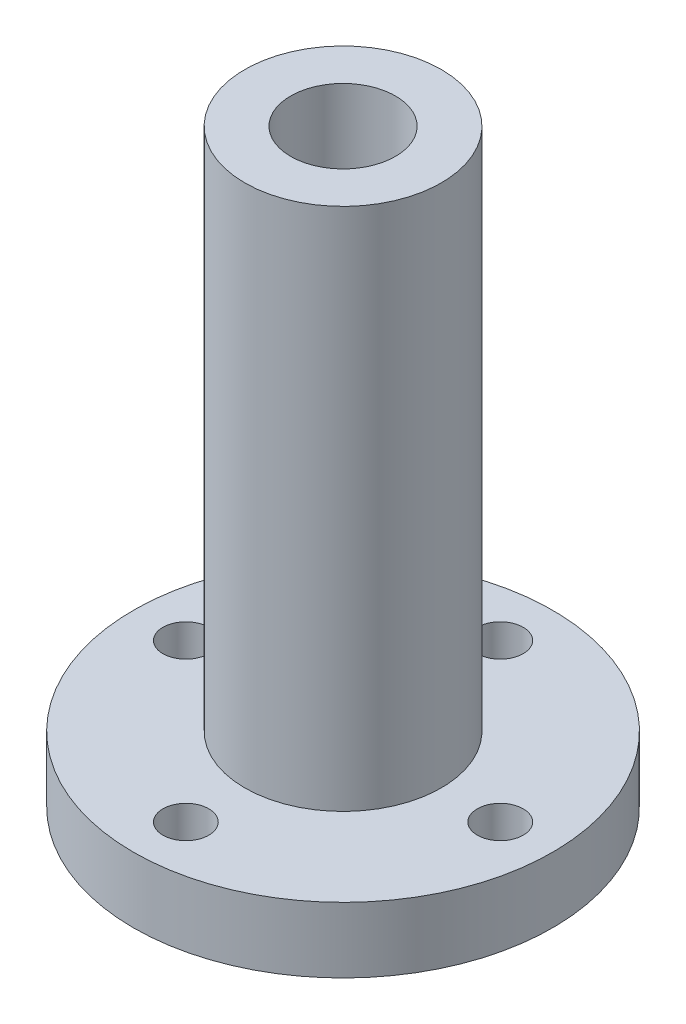
ISO-10303-21;
HEADER;
FILE_DESCRIPTION(('STEP AP214'),'2;1');
FILE_NAME('part.step','',(''),(''),'','','');
FILE_SCHEMA(('AUTOMOTIVE_DESIGN { 1 0 10303 214 1 1 1 1 }'));
ENDSEC;
DATA;
#1=APPLICATION_CONTEXT('core data for automotive mechanical design processes');
#2=APPLICATION_PROTOCOL_DEFINITION('international standard','automotive_design',2000,#1);
#3=PRODUCT_CONTEXT('',#1,'mechanical');
#4=PRODUCT('Part','Part','',(#3));
#5=PRODUCT_RELATED_PRODUCT_CATEGORY('part','',(#4));
#6=PRODUCT_DEFINITION_FORMATION('','',#4);
#7=PRODUCT_DEFINITION_CONTEXT('part definition',#1,'design');
#8=PRODUCT_DEFINITION('design','',#6,#7);
#9=PRODUCT_DEFINITION_SHAPE('','',#8);
#10=(LENGTH_UNIT() NAMED_UNIT(*) SI_UNIT(.MILLI.,.METRE.));
#11=(NAMED_UNIT(*) PLANE_ANGLE_UNIT() SI_UNIT($,.RADIAN.));
#12=(NAMED_UNIT(*) SI_UNIT($,.STERADIAN.) SOLID_ANGLE_UNIT());
#13=UNCERTAINTY_MEASURE_WITH_UNIT(LENGTH_MEASURE(1.E-05),#10,'distance_accuracy_value','');
#14=(GEOMETRIC_REPRESENTATION_CONTEXT(3) GLOBAL_UNCERTAINTY_ASSIGNED_CONTEXT((#13)) GLOBAL_UNIT_ASSIGNED_CONTEXT((#10,
#11,#12)) REPRESENTATION_CONTEXT('',''));
#15=CARTESIAN_POINT('',(0.,0.,0.));
#16=DIRECTION('',(0.,0.,1.));
#17=DIRECTION('',(1.,0.,0.));
#18=AXIS2_PLACEMENT_3D('',#15,#16,#17);
#19=CARTESIAN_POINT('',(0.,5.,0.));
#20=DIRECTION('',(0.,1.,0.));
#21=DIRECTION('',(0.,0.,1.));
#22=AXIS2_PLACEMENT_3D('',#19,#20,#21);
#23=PLANE('',#22);
#24=CARTESIAN_POINT('',(0.,5.,12.));
#25=DIRECTION('',(0.,1.,0.));
#26=DIRECTION('',(0.,0.,1.));
#27=AXIS2_PLACEMENT_3D('',#24,#25,#26);
#28=CIRCLE('',#27,1.75);
#29=CARTESIAN_POINT('',(0.,5.,13.75));
#30=VERTEX_POINT('',#29);
#31=EDGE_CURVE('E64',#30,#30,#28,.T.);
#32=ORIENTED_EDGE('',*,*,#31,.F.);
#33=EDGE_LOOP('',(#32));
#34=FACE_BOUND('',#33,.T.);
#35=CARTESIAN_POINT('',(-12.,5.,0.));
#36=DIRECTION('',(0.,1.,0.));
#37=DIRECTION('',(0.,0.,1.));
#38=AXIS2_PLACEMENT_3D('',#35,#36,#37);
#39=CIRCLE('',#38,1.75);
#40=CARTESIAN_POINT('',(-12.,5.,1.75));
#41=VERTEX_POINT('',#40);
#42=EDGE_CURVE('E52',#41,#41,#39,.T.);
#43=ORIENTED_EDGE('',*,*,#42,.F.);
#44=EDGE_LOOP('',(#43));
#45=FACE_BOUND('',#44,.T.);
#46=CARTESIAN_POINT('',(0.,5.,0.));
#47=DIRECTION('',(0.,1.,0.));
#48=DIRECTION('',(0.,0.,1.));
#49=AXIS2_PLACEMENT_3D('',#46,#47,#48);
#50=CIRCLE('',#49,16.);
#51=CARTESIAN_POINT('',(0.,5.,16.));
#52=VERTEX_POINT('',#51);
#53=EDGE_CURVE('E10',#52,#52,#50,.T.);
#54=ORIENTED_EDGE('',*,*,#53,.T.);
#55=EDGE_LOOP('',(#54));
#56=FACE_BOUND('',#55,.T.);
#57=CARTESIAN_POINT('',(0.,5.,-12.));
#58=DIRECTION('',(0.,1.,0.));
#59=DIRECTION('',(0.,0.,1.));
#60=AXIS2_PLACEMENT_3D('',#57,#58,#59);
#61=CIRCLE('',#60,1.75);
#62=CARTESIAN_POINT('',(0.,5.,-10.25));
#63=VERTEX_POINT('',#62);
#64=EDGE_CURVE('E48',#63,#63,#61,.T.);
#65=ORIENTED_EDGE('',*,*,#64,.F.);
#66=EDGE_LOOP('',(#65));
#67=FACE_BOUND('',#66,.T.);
#68=CARTESIAN_POINT('',(12.,5.,0.));
#69=DIRECTION('',(0.,1.,0.));
#70=DIRECTION('',(0.,0.,1.));
#71=AXIS2_PLACEMENT_3D('',#68,#69,#70);
#72=CIRCLE('',#71,1.75);
#73=CARTESIAN_POINT('',(12.,5.,1.75));
#74=VERTEX_POINT('',#73);
#75=EDGE_CURVE('E58',#74,#74,#72,.T.);
#76=ORIENTED_EDGE('',*,*,#75,.F.);
#77=EDGE_LOOP('',(#76));
#78=FACE_BOUND('',#77,.T.);
#79=CARTESIAN_POINT('',(0.,5.,0.));
#80=DIRECTION('',(0.,1.,0.));
#81=DIRECTION('',(0.,0.,1.));
#82=AXIS2_PLACEMENT_3D('',#79,#80,#81);
#83=CIRCLE('',#82,7.5);
#84=CARTESIAN_POINT('',(0.,5.,7.5));
#85=VERTEX_POINT('',#84);
#86=EDGE_CURVE('E73',#85,#85,#83,.T.);
#87=ORIENTED_EDGE('',*,*,#86,.F.);
#88=EDGE_LOOP('',(#87));
#89=FACE_BOUND('',#88,.T.);
#90=ADVANCED_FACE('F33',(#34,#45,#56,#67,#78,#89),#23,.T.);
#91=CARTESIAN_POINT('',(0.,0.,0.));
#92=DIRECTION('',(0.,1.,0.));
#93=DIRECTION('',(0.,0.,1.));
#94=AXIS2_PLACEMENT_3D('',#91,#92,#93);
#95=PLANE('',#94);
#96=CARTESIAN_POINT('',(0.,0.,0.));
#97=DIRECTION('',(0.,1.,0.));
#98=DIRECTION('',(0.,0.,1.));
#99=AXIS2_PLACEMENT_3D('',#96,#97,#98);
#100=CIRCLE('',#99,16.);
#101=CARTESIAN_POINT('',(0.,0.,16.));
#102=VERTEX_POINT('',#101);
#103=EDGE_CURVE('E37',#102,#102,#100,.T.);
#104=ORIENTED_EDGE('',*,*,#103,.F.);
#105=EDGE_LOOP('',(#104));
#106=FACE_BOUND('',#105,.T.);
#107=CARTESIAN_POINT('',(0.,0.,0.));
#108=DIRECTION('',(0.,1.,0.));
#109=DIRECTION('',(0.,0.,1.));
#110=AXIS2_PLACEMENT_3D('',#107,#108,#109);
#111=CIRCLE('',#110,4.);
#112=CARTESIAN_POINT('',(0.,0.,4.));
#113=VERTEX_POINT('',#112);
#114=EDGE_CURVE('E44',#113,#113,#111,.T.);
#115=ORIENTED_EDGE('',*,*,#114,.T.);
#116=EDGE_LOOP('',(#115));
#117=FACE_BOUND('',#116,.T.);
#118=CARTESIAN_POINT('',(0.,0.,-12.));
#119=DIRECTION('',(0.,1.,0.));
#120=DIRECTION('',(0.,0.,1.));
#121=AXIS2_PLACEMENT_3D('',#118,#119,#120);
#122=CIRCLE('',#121,1.75);
#123=CARTESIAN_POINT('',(0.,0.,-10.25));
#124=VERTEX_POINT('',#123);
#125=EDGE_CURVE('E49',#124,#124,#122,.T.);
#126=ORIENTED_EDGE('',*,*,#125,.T.);
#127=EDGE_LOOP('',(#126));
#128=FACE_BOUND('',#127,.T.);
#129=CARTESIAN_POINT('',(-12.,0.,0.));
#130=DIRECTION('',(0.,1.,0.));
#131=DIRECTION('',(0.,0.,1.));
#132=AXIS2_PLACEMENT_3D('',#129,#130,#131);
#133=CIRCLE('',#132,1.75);
#134=CARTESIAN_POINT('',(-12.,0.,1.75));
#135=VERTEX_POINT('',#134);
#136=EDGE_CURVE('E55',#135,#135,#133,.T.);
#137=ORIENTED_EDGE('',*,*,#136,.T.);
#138=EDGE_LOOP('',(#137));
#139=FACE_BOUND('',#138,.T.);
#140=CARTESIAN_POINT('',(12.,0.,0.));
#141=DIRECTION('',(0.,1.,0.));
#142=DIRECTION('',(0.,0.,1.));
#143=AXIS2_PLACEMENT_3D('',#140,#141,#142);
#144=CIRCLE('',#143,1.75);
#145=CARTESIAN_POINT('',(12.,0.,1.75));
#146=VERTEX_POINT('',#145);
#147=EDGE_CURVE('E61',#146,#146,#144,.T.);
#148=ORIENTED_EDGE('',*,*,#147,.T.);
#149=EDGE_LOOP('',(#148));
#150=FACE_BOUND('',#149,.T.);
#151=CARTESIAN_POINT('',(0.,0.,12.));
#152=DIRECTION('',(0.,1.,0.));
#153=DIRECTION('',(0.,0.,1.));
#154=AXIS2_PLACEMENT_3D('',#151,#152,#153);
#155=CIRCLE('',#154,1.75);
#156=CARTESIAN_POINT('',(0.,0.,13.75));
#157=VERTEX_POINT('',#156);
#158=EDGE_CURVE('E67',#157,#157,#155,.T.);
#159=ORIENTED_EDGE('',*,*,#158,.T.);
#160=EDGE_LOOP('',(#159));
#161=FACE_BOUND('',#160,.T.);
#162=ADVANCED_FACE('F100',(#106,#117,#128,#139,#150,#161),#95,.F.);
#163=CARTESIAN_POINT('',(0.,5.,0.));
#164=DIRECTION('',(0.,-1.,0.));
#165=DIRECTION('',(0.,0.,-1.));
#166=AXIS2_PLACEMENT_3D('',#163,#164,#165);
#167=CYLINDRICAL_SURFACE('',#166,16.);
#168=ORIENTED_EDGE('',*,*,#53,.F.);
#169=EDGE_LOOP('',(#168));
#170=FACE_BOUND('',#169,.T.);
#171=ORIENTED_EDGE('',*,*,#103,.T.);
#172=EDGE_LOOP('',(#171));
#173=FACE_BOUND('',#172,.T.);
#174=ADVANCED_FACE('F35',(#170,#173),#167,.T.);
#175=CARTESIAN_POINT('',(0.,5.,0.));
#176=DIRECTION('',(0.,-1.,0.));
#177=DIRECTION('',(0.,0.,-1.));
#178=AXIS2_PLACEMENT_3D('',#175,#176,#177);
#179=CYLINDRICAL_SURFACE('',#178,4.);
#180=ORIENTED_EDGE('',*,*,#114,.F.);
#181=EDGE_LOOP('',(#180));
#182=FACE_BOUND('',#181,.T.);
#183=CARTESIAN_POINT('',(0.,45.,0.));
#184=DIRECTION('',(0.,1.,0.));
#185=DIRECTION('',(0.,0.,1.));
#186=AXIS2_PLACEMENT_3D('',#183,#184,#185);
#187=CIRCLE('',#186,4.);
#188=CARTESIAN_POINT('',(0.,45.,4.));
#189=VERTEX_POINT('',#188);
#190=EDGE_CURVE('E76',#189,#189,#187,.T.);
#191=ORIENTED_EDGE('',*,*,#190,.T.);
#192=EDGE_LOOP('',(#191));
#193=FACE_BOUND('',#192,.T.);
#194=ADVANCED_FACE('F82',(#182,#193),#179,.F.);
#195=CARTESIAN_POINT('',(0.,5.,-12.));
#196=DIRECTION('',(0.,-1.,0.));
#197=DIRECTION('',(0.,0.,-1.));
#198=AXIS2_PLACEMENT_3D('',#195,#196,#197);
#199=CYLINDRICAL_SURFACE('',#198,1.75);
#200=ORIENTED_EDGE('',*,*,#64,.T.);
#201=EDGE_LOOP('',(#200));
#202=FACE_BOUND('',#201,.T.);
#203=ORIENTED_EDGE('',*,*,#125,.F.);
#204=EDGE_LOOP('',(#203));
#205=FACE_BOUND('',#204,.T.);
#206=ADVANCED_FACE('F112',(#202,#205),#199,.F.);
#207=CARTESIAN_POINT('',(-12.,5.,0.));
#208=DIRECTION('',(0.,-1.,0.));
#209=DIRECTION('',(0.,0.,-1.));
#210=AXIS2_PLACEMENT_3D('',#207,#208,#209);
#211=CYLINDRICAL_SURFACE('',#210,1.75);
#212=ORIENTED_EDGE('',*,*,#42,.T.);
#213=EDGE_LOOP('',(#212));
#214=FACE_BOUND('',#213,.T.);
#215=ORIENTED_EDGE('',*,*,#136,.F.);
#216=EDGE_LOOP('',(#215));
#217=FACE_BOUND('',#216,.T.);
#218=ADVANCED_FACE('F116',(#214,#217),#211,.F.);
#219=CARTESIAN_POINT('',(12.,5.,0.));
#220=DIRECTION('',(0.,-1.,0.));
#221=DIRECTION('',(0.,0.,-1.));
#222=AXIS2_PLACEMENT_3D('',#219,#220,#221);
#223=CYLINDRICAL_SURFACE('',#222,1.75);
#224=ORIENTED_EDGE('',*,*,#75,.T.);
#225=EDGE_LOOP('',(#224));
#226=FACE_BOUND('',#225,.T.);
#227=ORIENTED_EDGE('',*,*,#147,.F.);
#228=EDGE_LOOP('',(#227));
#229=FACE_BOUND('',#228,.T.);
#230=ADVANCED_FACE('F96',(#226,#229),#223,.F.);
#231=CARTESIAN_POINT('',(0.,5.,12.));
#232=DIRECTION('',(0.,-1.,0.));
#233=DIRECTION('',(0.,0.,-1.));
#234=AXIS2_PLACEMENT_3D('',#231,#232,#233);
#235=CYLINDRICAL_SURFACE('',#234,1.75);
#236=ORIENTED_EDGE('',*,*,#31,.T.);
#237=EDGE_LOOP('',(#236));
#238=FACE_BOUND('',#237,.T.);
#239=ORIENTED_EDGE('',*,*,#158,.F.);
#240=EDGE_LOOP('',(#239));
#241=FACE_BOUND('',#240,.T.);
#242=ADVANCED_FACE('F87',(#238,#241),#235,.F.);
#243=CARTESIAN_POINT('',(0.,45.,0.));
#244=DIRECTION('',(0.,1.,0.));
#245=DIRECTION('',(0.,0.,1.));
#246=AXIS2_PLACEMENT_3D('',#243,#244,#245);
#247=PLANE('',#246);
#248=CARTESIAN_POINT('',(0.,45.,0.));
#249=DIRECTION('',(0.,1.,0.));
#250=DIRECTION('',(0.,0.,1.));
#251=AXIS2_PLACEMENT_3D('',#248,#249,#250);
#252=CIRCLE('',#251,7.5);
#253=CARTESIAN_POINT('',(0.,45.,7.5));
#254=VERTEX_POINT('',#253);
#255=EDGE_CURVE('E70',#254,#254,#252,.T.);
#256=ORIENTED_EDGE('',*,*,#255,.T.);
#257=EDGE_LOOP('',(#256));
#258=FACE_BOUND('',#257,.T.);
#259=ORIENTED_EDGE('',*,*,#190,.F.);
#260=EDGE_LOOP('',(#259));
#261=FACE_BOUND('',#260,.T.);
#262=ADVANCED_FACE('F84',(#258,#261),#247,.T.);
#263=CARTESIAN_POINT('',(0.,45.,0.));
#264=DIRECTION('',(0.,-1.,0.));
#265=DIRECTION('',(0.,0.,-1.));
#266=AXIS2_PLACEMENT_3D('',#263,#264,#265);
#267=CYLINDRICAL_SURFACE('',#266,7.5);
#268=ORIENTED_EDGE('',*,*,#255,.F.);
#269=EDGE_LOOP('',(#268));
#270=FACE_BOUND('',#269,.T.);
#271=ORIENTED_EDGE('',*,*,#86,.T.);
#272=EDGE_LOOP('',(#271));
#273=FACE_BOUND('',#272,.T.);
#274=ADVANCED_FACE('F86',(#270,#273),#267,.T.);
#275=CLOSED_SHELL('',(#90,#162,#174,#194,#206,#218,#230,#242,#262,#274));
#276=MANIFOLD_SOLID_BREP('B2',#275);
#277=ADVANCED_BREP_SHAPE_REPRESENTATION('',(#18,#276),#14);
#278=SHAPE_DEFINITION_REPRESENTATION(#9,#277);
ENDSEC;
END-ISO-10303-21;
